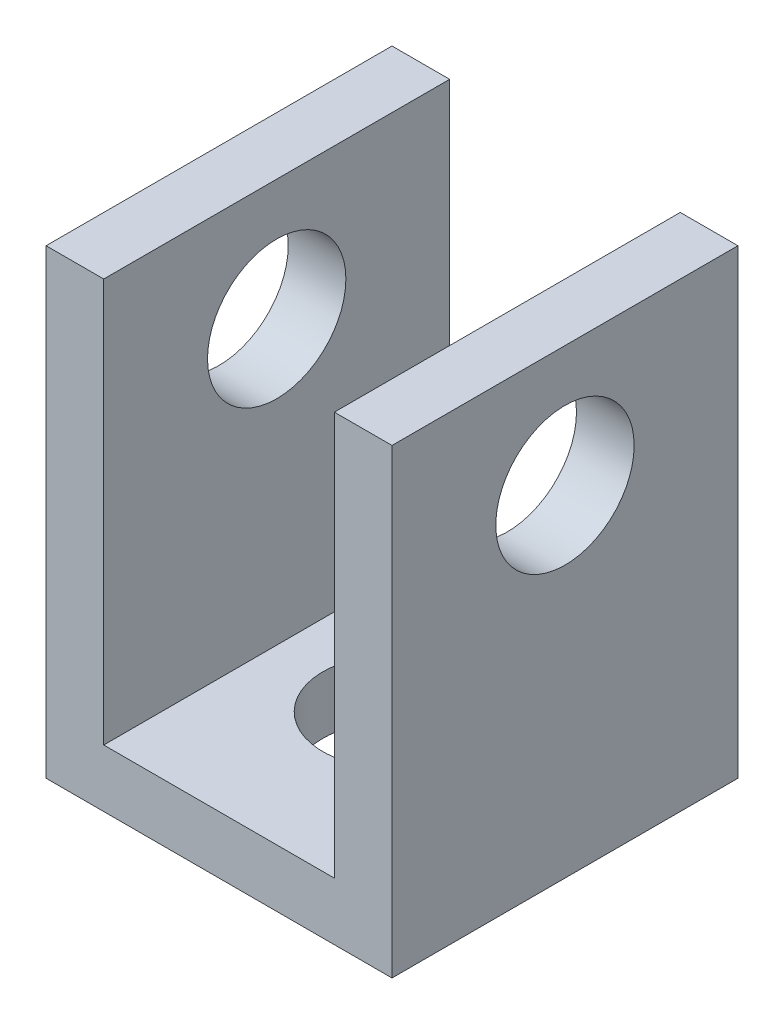
ISO-10303-21;
HEADER;
FILE_DESCRIPTION(('STEP AP214'),'2;1');
FILE_NAME('part.step','',(''),(''),'','','');
FILE_SCHEMA(('AUTOMOTIVE_DESIGN { 1 0 10303 214 1 1 1 1 }'));
ENDSEC;
DATA;
#1=APPLICATION_CONTEXT('core data for automotive mechanical design processes');
#2=APPLICATION_PROTOCOL_DEFINITION('international standard','automotive_design',2000,#1);
#3=PRODUCT_CONTEXT('',#1,'mechanical');
#4=PRODUCT('Part','Part','',(#3));
#5=PRODUCT_RELATED_PRODUCT_CATEGORY('part','',(#4));
#6=PRODUCT_DEFINITION_FORMATION('','',#4);
#7=PRODUCT_DEFINITION_CONTEXT('part definition',#1,'design');
#8=PRODUCT_DEFINITION('design','',#6,#7);
#9=PRODUCT_DEFINITION_SHAPE('','',#8);
#10=(LENGTH_UNIT() NAMED_UNIT(*) SI_UNIT(.MILLI.,.METRE.));
#11=(NAMED_UNIT(*) PLANE_ANGLE_UNIT() SI_UNIT($,.RADIAN.));
#12=(NAMED_UNIT(*) SI_UNIT($,.STERADIAN.) SOLID_ANGLE_UNIT());
#13=UNCERTAINTY_MEASURE_WITH_UNIT(LENGTH_MEASURE(1.E-05),#10,'distance_accuracy_value','');
#14=(GEOMETRIC_REPRESENTATION_CONTEXT(3) GLOBAL_UNCERTAINTY_ASSIGNED_CONTEXT((#13)) GLOBAL_UNIT_ASSIGNED_CONTEXT((#10,
#11,#12)) REPRESENTATION_CONTEXT('',''));
#15=CARTESIAN_POINT('',(0.,0.,0.));
#16=DIRECTION('',(0.,0.,1.));
#17=DIRECTION('',(1.,0.,0.));
#18=AXIS2_PLACEMENT_3D('',#15,#16,#17);
#19=CARTESIAN_POINT('',(-30.1753227270851,12.3518767281582,15.));
#20=DIRECTION('',(0.,-1.,0.));
#21=DIRECTION('',(0.,0.,-1.));
#22=AXIS2_PLACEMENT_3D('',#19,#20,#21);
#23=PLANE('',#22);
#24=DIRECTION('',(-1.,0.,0.));
#25=VECTOR('',#24,1.);
#26=CARTESIAN_POINT('',(-30.1753227270851,12.3518767281582,0.));
#27=LINE('',#26,#25);
#28=CARTESIAN_POINT('',(-27.6753227270851,12.3518767281582,0.));
#29=VERTEX_POINT('',#28);
#30=CARTESIAN_POINT('',(-30.1753227270851,12.3518767281582,0.));
#31=VERTEX_POINT('',#30);
#32=EDGE_CURVE('E130',#29,#31,#27,.T.);
#33=ORIENTED_EDGE('',*,*,#32,.T.);
#34=DIRECTION('',(0.,0.,-1.));
#35=VECTOR('',#34,1.);
#36=CARTESIAN_POINT('',(-30.1753227270851,12.3518767281582,15.));
#37=LINE('',#36,#35);
#38=CARTESIAN_POINT('',(-30.1753227270851,12.3518767281582,15.));
#39=VERTEX_POINT('',#38);
#40=EDGE_CURVE('E11',#39,#31,#37,.T.);
#41=ORIENTED_EDGE('',*,*,#40,.F.);
#42=DIRECTION('',(-1.,0.,0.));
#43=VECTOR('',#42,1.);
#44=CARTESIAN_POINT('',(-30.1753227270851,12.3518767281582,15.));
#45=LINE('',#44,#43);
#46=CARTESIAN_POINT('',(-27.6753227270851,12.3518767281582,15.));
#47=VERTEX_POINT('',#46);
#48=EDGE_CURVE('E145',#47,#39,#45,.T.);
#49=ORIENTED_EDGE('',*,*,#48,.F.);
#50=DIRECTION('',(0.,0.,-1.));
#51=VECTOR('',#50,1.);
#52=CARTESIAN_POINT('',(-27.6753227270851,12.3518767281582,15.));
#53=LINE('',#52,#51);
#54=EDGE_CURVE('E126',#47,#29,#53,.T.);
#55=ORIENTED_EDGE('',*,*,#54,.T.);
#56=EDGE_LOOP('',(#33,#41,#49,#55));
#57=FACE_BOUND('',#56,.T.);
#58=ADVANCED_FACE('F32',(#57),#23,.F.);
#59=CARTESIAN_POINT('',(-30.1753227270851,12.3518767281582,15.));
#60=DIRECTION('',(1.,0.,0.));
#61=DIRECTION('',(0.,0.,-1.));
#62=AXIS2_PLACEMENT_3D('',#59,#60,#61);
#63=PLANE('',#62);
#64=CARTESIAN_POINT('',(-30.1753227270851,7.1040536915522,7.5));
#65=DIRECTION('',(1.,0.,0.));
#66=DIRECTION('',(0.,0.,-1.));
#67=AXIS2_PLACEMENT_3D('',#64,#65,#66);
#68=CIRCLE('',#67,3.);
#69=CARTESIAN_POINT('',(-30.1753227270851,7.1040536915522,4.5));
#70=VERTEX_POINT('',#69);
#71=EDGE_CURVE('E134',#70,#70,#68,.T.);
#72=ORIENTED_EDGE('',*,*,#71,.T.);
#73=EDGE_LOOP('',(#72));
#74=FACE_BOUND('',#73,.T.);
#75=DIRECTION('',(0.,-1.,0.));
#76=VECTOR('',#75,1.);
#77=CARTESIAN_POINT('',(-30.1753227270851,12.3518767281582,0.));
#78=LINE('',#77,#76);
#79=CARTESIAN_POINT('',(-30.1753227270851,-7.64812327184185,0.));
#80=VERTEX_POINT('',#79);
#81=EDGE_CURVE('E133',#31,#80,#78,.T.);
#82=ORIENTED_EDGE('',*,*,#81,.T.);
#83=DIRECTION('',(0.,0.,-1.));
#84=VECTOR('',#83,1.);
#85=CARTESIAN_POINT('',(-30.1753227270851,-7.64812327184185,15.));
#86=LINE('',#85,#84);
#87=CARTESIAN_POINT('',(-30.1753227270851,-7.64812327184185,15.));
#88=VERTEX_POINT('',#87);
#89=EDGE_CURVE('E41',#88,#80,#86,.T.);
#90=ORIENTED_EDGE('',*,*,#89,.F.);
#91=DIRECTION('',(0.,-1.,0.));
#92=VECTOR('',#91,1.);
#93=CARTESIAN_POINT('',(-30.1753227270851,12.3518767281582,15.));
#94=LINE('',#93,#92);
#95=EDGE_CURVE('E93',#39,#88,#94,.T.);
#96=ORIENTED_EDGE('',*,*,#95,.F.);
#97=ORIENTED_EDGE('',*,*,#40,.T.);
#98=EDGE_LOOP('',(#82,#90,#96,#97));
#99=FACE_BOUND('',#98,.T.);
#100=ADVANCED_FACE('F208',(#74,#99),#63,.F.);
#101=CARTESIAN_POINT('',(-30.1753227270851,-7.64812327184185,15.));
#102=DIRECTION('',(0.,1.,0.));
#103=DIRECTION('',(0.,0.,1.));
#104=AXIS2_PLACEMENT_3D('',#101,#102,#103);
#105=PLANE('',#104);
#106=CARTESIAN_POINT('',(-22.6753227270851,-7.64812327184185,7.5));
#107=DIRECTION('',(0.,-1.,0.));
#108=DIRECTION('',(0.,0.,-1.));
#109=AXIS2_PLACEMENT_3D('',#106,#107,#108);
#110=CIRCLE('',#109,3.);
#111=CARTESIAN_POINT('',(-22.6753227270851,-7.64812327184185,4.5));
#112=VERTEX_POINT('',#111);
#113=EDGE_CURVE('E169',#112,#112,#110,.T.);
#114=ORIENTED_EDGE('',*,*,#113,.F.);
#115=EDGE_LOOP('',(#114));
#116=FACE_BOUND('',#115,.T.);
#117=DIRECTION('',(1.,0.,0.));
#118=VECTOR('',#117,1.);
#119=CARTESIAN_POINT('',(-30.1753227270851,-7.64812327184185,0.));
#120=LINE('',#119,#118);
#121=CARTESIAN_POINT('',(-15.1753227270851,-7.64812327184185,0.));
#122=VERTEX_POINT('',#121);
#123=EDGE_CURVE('E136',#80,#122,#120,.T.);
#124=ORIENTED_EDGE('',*,*,#123,.T.);
#125=DIRECTION('',(0.,0.,-1.));
#126=VECTOR('',#125,1.);
#127=CARTESIAN_POINT('',(-15.1753227270851,-7.64812327184185,15.));
#128=LINE('',#127,#126);
#129=CARTESIAN_POINT('',(-15.1753227270851,-7.64812327184185,15.));
#130=VERTEX_POINT('',#129);
#131=EDGE_CURVE('E152',#130,#122,#128,.T.);
#132=ORIENTED_EDGE('',*,*,#131,.F.);
#133=DIRECTION('',(1.,0.,0.));
#134=VECTOR('',#133,1.);
#135=CARTESIAN_POINT('',(-30.1753227270851,-7.64812327184185,15.));
#136=LINE('',#135,#134);
#137=EDGE_CURVE('E176',#88,#130,#136,.T.);
#138=ORIENTED_EDGE('',*,*,#137,.F.);
#139=ORIENTED_EDGE('',*,*,#89,.T.);
#140=EDGE_LOOP('',(#124,#132,#138,#139));
#141=FACE_BOUND('',#140,.T.);
#142=ADVANCED_FACE('F212',(#116,#141),#105,.F.);
#143=CARTESIAN_POINT('',(-15.1753227270851,-7.64812327184185,15.));
#144=DIRECTION('',(-1.,0.,0.));
#145=DIRECTION('',(0.,0.,1.));
#146=AXIS2_PLACEMENT_3D('',#143,#144,#145);
#147=PLANE('',#146);
#148=CARTESIAN_POINT('',(-15.1753227270851,7.1040536915522,7.5));
#149=DIRECTION('',(1.,0.,0.));
#150=DIRECTION('',(0.,0.,-1.));
#151=AXIS2_PLACEMENT_3D('',#148,#149,#150);
#152=CIRCLE('',#151,3.);
#153=CARTESIAN_POINT('',(-15.1753227270851,7.1040536915522,4.5));
#154=VERTEX_POINT('',#153);
#155=EDGE_CURVE('E159',#154,#154,#152,.T.);
#156=ORIENTED_EDGE('',*,*,#155,.F.);
#157=EDGE_LOOP('',(#156));
#158=FACE_BOUND('',#157,.T.);
#159=DIRECTION('',(0.,1.,0.));
#160=VECTOR('',#159,1.);
#161=CARTESIAN_POINT('',(-15.1753227270851,-7.64812327184185,0.));
#162=LINE('',#161,#160);
#163=CARTESIAN_POINT('',(-15.1753227270851,12.3518767281582,0.));
#164=VERTEX_POINT('',#163);
#165=EDGE_CURVE('E138',#122,#164,#162,.T.);
#166=ORIENTED_EDGE('',*,*,#165,.T.);
#167=DIRECTION('',(0.,0.,-1.));
#168=VECTOR('',#167,1.);
#169=CARTESIAN_POINT('',(-15.1753227270851,12.3518767281582,15.));
#170=LINE('',#169,#168);
#171=CARTESIAN_POINT('',(-15.1753227270851,12.3518767281582,15.));
#172=VERTEX_POINT('',#171);
#173=EDGE_CURVE('E149',#172,#164,#170,.T.);
#174=ORIENTED_EDGE('',*,*,#173,.F.);
#175=DIRECTION('',(0.,1.,0.));
#176=VECTOR('',#175,1.);
#177=CARTESIAN_POINT('',(-15.1753227270851,-7.64812327184185,15.));
#178=LINE('',#177,#176);
#179=EDGE_CURVE('E178',#130,#172,#178,.T.);
#180=ORIENTED_EDGE('',*,*,#179,.F.);
#181=ORIENTED_EDGE('',*,*,#131,.T.);
#182=EDGE_LOOP('',(#166,#174,#180,#181));
#183=FACE_BOUND('',#182,.T.);
#184=ADVANCED_FACE('F184',(#158,#183),#147,.F.);
#185=CARTESIAN_POINT('',(-17.6753227270851,12.3518767281582,15.));
#186=DIRECTION('',(0.,-1.,0.));
#187=DIRECTION('',(0.,0.,-1.));
#188=AXIS2_PLACEMENT_3D('',#185,#186,#187);
#189=PLANE('',#188);
#190=DIRECTION('',(-1.,0.,0.));
#191=VECTOR('',#190,1.);
#192=CARTESIAN_POINT('',(-17.6753227270851,12.3518767281582,0.));
#193=LINE('',#192,#191);
#194=CARTESIAN_POINT('',(-17.6753227270851,12.3518767281582,0.));
#195=VERTEX_POINT('',#194);
#196=EDGE_CURVE('E140',#164,#195,#193,.T.);
#197=ORIENTED_EDGE('',*,*,#196,.T.);
#198=DIRECTION('',(0.,0.,-1.));
#199=VECTOR('',#198,1.);
#200=CARTESIAN_POINT('',(-17.6753227270851,12.3518767281582,15.));
#201=LINE('',#200,#199);
#202=CARTESIAN_POINT('',(-17.6753227270851,12.3518767281582,15.));
#203=VERTEX_POINT('',#202);
#204=EDGE_CURVE('E121',#203,#195,#201,.T.);
#205=ORIENTED_EDGE('',*,*,#204,.F.);
#206=DIRECTION('',(-1.,0.,0.));
#207=VECTOR('',#206,1.);
#208=CARTESIAN_POINT('',(-17.6753227270851,12.3518767281582,15.));
#209=LINE('',#208,#207);
#210=EDGE_CURVE('E112',#172,#203,#209,.T.);
#211=ORIENTED_EDGE('',*,*,#210,.F.);
#212=ORIENTED_EDGE('',*,*,#173,.T.);
#213=EDGE_LOOP('',(#197,#205,#211,#212));
#214=FACE_BOUND('',#213,.T.);
#215=ADVANCED_FACE('F188',(#214),#189,.F.);
#216=CARTESIAN_POINT('',(-17.6753227270851,-5.14812327184185,15.));
#217=DIRECTION('',(1.,0.,0.));
#218=DIRECTION('',(0.,0.,-1.));
#219=AXIS2_PLACEMENT_3D('',#216,#217,#218);
#220=PLANE('',#219);
#221=CARTESIAN_POINT('',(-17.6753227270851,7.1040536915522,7.5));
#222=DIRECTION('',(1.,0.,0.));
#223=DIRECTION('',(0.,0.,-1.));
#224=AXIS2_PLACEMENT_3D('',#221,#222,#223);
#225=CIRCLE('',#224,3.);
#226=CARTESIAN_POINT('',(-17.6753227270851,7.1040536915522,4.5));
#227=VERTEX_POINT('',#226);
#228=EDGE_CURVE('E158',#227,#227,#225,.T.);
#229=ORIENTED_EDGE('',*,*,#228,.T.);
#230=EDGE_LOOP('',(#229));
#231=FACE_BOUND('',#230,.T.);
#232=DIRECTION('',(0.,-1.,0.));
#233=VECTOR('',#232,1.);
#234=CARTESIAN_POINT('',(-17.6753227270851,-5.14812327184185,0.));
#235=LINE('',#234,#233);
#236=CARTESIAN_POINT('',(-17.6753227270851,-5.14812327184185,0.));
#237=VERTEX_POINT('',#236);
#238=EDGE_CURVE('E120',#195,#237,#235,.T.);
#239=ORIENTED_EDGE('',*,*,#238,.T.);
#240=DIRECTION('',(0.,0.,-1.));
#241=VECTOR('',#240,1.);
#242=CARTESIAN_POINT('',(-17.6753227270851,-5.14812327184185,15.));
#243=LINE('',#242,#241);
#244=CARTESIAN_POINT('',(-17.6753227270851,-5.14812327184185,15.));
#245=VERTEX_POINT('',#244);
#246=EDGE_CURVE('E117',#245,#237,#243,.T.);
#247=ORIENTED_EDGE('',*,*,#246,.F.);
#248=DIRECTION('',(0.,-1.,0.));
#249=VECTOR('',#248,1.);
#250=CARTESIAN_POINT('',(-17.6753227270851,-5.14812327184185,15.));
#251=LINE('',#250,#249);
#252=EDGE_CURVE('E106',#203,#245,#251,.T.);
#253=ORIENTED_EDGE('',*,*,#252,.F.);
#254=ORIENTED_EDGE('',*,*,#204,.T.);
#255=EDGE_LOOP('',(#239,#247,#253,#254));
#256=FACE_BOUND('',#255,.T.);
#257=ADVANCED_FACE('F118',(#231,#256),#220,.F.);
#258=CARTESIAN_POINT('',(-27.6753227270851,-5.14812327184185,15.));
#259=DIRECTION('',(0.,-1.,0.));
#260=DIRECTION('',(0.,0.,-1.));
#261=AXIS2_PLACEMENT_3D('',#258,#259,#260);
#262=PLANE('',#261);
#263=CARTESIAN_POINT('',(-22.6753227270851,-5.14812327184185,7.5));
#264=DIRECTION('',(0.,-1.,0.));
#265=DIRECTION('',(0.,0.,-1.));
#266=AXIS2_PLACEMENT_3D('',#263,#264,#265);
#267=CIRCLE('',#266,3.);
#268=CARTESIAN_POINT('',(-22.6753227270851,-5.14812327184185,4.5));
#269=VERTEX_POINT('',#268);
#270=EDGE_CURVE('E35',#269,#269,#267,.T.);
#271=ORIENTED_EDGE('',*,*,#270,.T.);
#272=EDGE_LOOP('',(#271));
#273=FACE_BOUND('',#272,.T.);
#274=DIRECTION('',(-1.,0.,0.));
#275=VECTOR('',#274,1.);
#276=CARTESIAN_POINT('',(-27.6753227270851,-5.14812327184185,0.));
#277=LINE('',#276,#275);
#278=CARTESIAN_POINT('',(-27.6753227270851,-5.14812327184185,0.));
#279=VERTEX_POINT('',#278);
#280=EDGE_CURVE('E79',#237,#279,#277,.T.);
#281=ORIENTED_EDGE('',*,*,#280,.T.);
#282=DIRECTION('',(0.,0.,-1.));
#283=VECTOR('',#282,1.);
#284=CARTESIAN_POINT('',(-27.6753227270851,-5.14812327184185,15.));
#285=LINE('',#284,#283);
#286=CARTESIAN_POINT('',(-27.6753227270851,-5.14812327184185,15.));
#287=VERTEX_POINT('',#286);
#288=EDGE_CURVE('E122',#287,#279,#285,.T.);
#289=ORIENTED_EDGE('',*,*,#288,.F.);
#290=DIRECTION('',(-1.,0.,0.));
#291=VECTOR('',#290,1.);
#292=CARTESIAN_POINT('',(-27.6753227270851,-5.14812327184185,15.));
#293=LINE('',#292,#291);
#294=EDGE_CURVE('E110',#245,#287,#293,.T.);
#295=ORIENTED_EDGE('',*,*,#294,.F.);
#296=ORIENTED_EDGE('',*,*,#246,.T.);
#297=EDGE_LOOP('',(#281,#289,#295,#296));
#298=FACE_BOUND('',#297,.T.);
#299=ADVANCED_FACE('F124',(#273,#298),#262,.F.);
#300=CARTESIAN_POINT('',(-27.6753227270851,12.3518767281582,15.));
#301=DIRECTION('',(-1.,0.,0.));
#302=DIRECTION('',(0.,0.,1.));
#303=AXIS2_PLACEMENT_3D('',#300,#301,#302);
#304=PLANE('',#303);
#305=CARTESIAN_POINT('',(-27.6753227270851,7.1040536915522,7.5));
#306=DIRECTION('',(-1.,0.,0.));
#307=DIRECTION('',(0.,0.,1.));
#308=AXIS2_PLACEMENT_3D('',#305,#306,#307);
#309=CIRCLE('',#308,3.);
#310=CARTESIAN_POINT('',(-27.6753227270851,7.1040536915522,10.5));
#311=VERTEX_POINT('',#310);
#312=EDGE_CURVE('E156',#311,#311,#309,.T.);
#313=ORIENTED_EDGE('',*,*,#312,.T.);
#314=EDGE_LOOP('',(#313));
#315=FACE_BOUND('',#314,.T.);
#316=DIRECTION('',(0.,1.,0.));
#317=VECTOR('',#316,1.);
#318=CARTESIAN_POINT('',(-27.6753227270851,12.3518767281582,0.));
#319=LINE('',#318,#317);
#320=EDGE_CURVE('E85',#279,#29,#319,.T.);
#321=ORIENTED_EDGE('',*,*,#320,.T.);
#322=ORIENTED_EDGE('',*,*,#54,.F.);
#323=DIRECTION('',(0.,1.,0.));
#324=VECTOR('',#323,1.);
#325=CARTESIAN_POINT('',(-27.6753227270851,12.3518767281582,15.));
#326=LINE('',#325,#324);
#327=EDGE_CURVE('E50',#287,#47,#326,.T.);
#328=ORIENTED_EDGE('',*,*,#327,.F.);
#329=ORIENTED_EDGE('',*,*,#288,.T.);
#330=EDGE_LOOP('',(#321,#322,#328,#329));
#331=FACE_BOUND('',#330,.T.);
#332=ADVANCED_FACE('F196',(#315,#331),#304,.F.);
#333=CARTESIAN_POINT('',(0.,0.,15.));
#334=DIRECTION('',(0.,0.,-1.));
#335=DIRECTION('',(-1.,0.,0.));
#336=AXIS2_PLACEMENT_3D('',#333,#334,#335);
#337=PLANE('',#336);
#338=ORIENTED_EDGE('',*,*,#48,.T.);
#339=ORIENTED_EDGE('',*,*,#95,.T.);
#340=ORIENTED_EDGE('',*,*,#137,.T.);
#341=ORIENTED_EDGE('',*,*,#179,.T.);
#342=ORIENTED_EDGE('',*,*,#210,.T.);
#343=ORIENTED_EDGE('',*,*,#252,.T.);
#344=ORIENTED_EDGE('',*,*,#294,.T.);
#345=ORIENTED_EDGE('',*,*,#327,.T.);
#346=EDGE_LOOP('',(#338,#339,#340,#341,#342,#343,#344,#345));
#347=FACE_BOUND('',#346,.T.);
#348=ADVANCED_FACE('F108',(#347),#337,.F.);
#349=CARTESIAN_POINT('',(0.,0.,0.));
#350=DIRECTION('',(0.,0.,-1.));
#351=DIRECTION('',(-1.,0.,0.));
#352=AXIS2_PLACEMENT_3D('',#349,#350,#351);
#353=PLANE('',#352);
#354=ORIENTED_EDGE('',*,*,#32,.F.);
#355=ORIENTED_EDGE('',*,*,#320,.F.);
#356=ORIENTED_EDGE('',*,*,#280,.F.);
#357=ORIENTED_EDGE('',*,*,#238,.F.);
#358=ORIENTED_EDGE('',*,*,#196,.F.);
#359=ORIENTED_EDGE('',*,*,#165,.F.);
#360=ORIENTED_EDGE('',*,*,#123,.F.);
#361=ORIENTED_EDGE('',*,*,#81,.F.);
#362=EDGE_LOOP('',(#354,#355,#356,#357,#358,#359,#360,#361));
#363=FACE_BOUND('',#362,.T.);
#364=ADVANCED_FACE('F191',(#363),#353,.T.);
#365=CARTESIAN_POINT('',(-32.1753227270851,7.1040536915522,7.5));
#366=DIRECTION('',(1.,0.,0.));
#367=DIRECTION('',(0.,0.,-1.));
#368=AXIS2_PLACEMENT_3D('',#365,#366,#367);
#369=CYLINDRICAL_SURFACE('',#368,3.);
#370=ORIENTED_EDGE('',*,*,#312,.F.);
#371=EDGE_LOOP('',(#370));
#372=FACE_BOUND('',#371,.T.);
#373=ORIENTED_EDGE('',*,*,#71,.F.);
#374=EDGE_LOOP('',(#373));
#375=FACE_BOUND('',#374,.T.);
#376=ADVANCED_FACE('F234',(#372,#375),#369,.F.);
#377=ORIENTED_EDGE('',*,*,#155,.T.);
#378=EDGE_LOOP('',(#377));
#379=FACE_BOUND('',#378,.T.);
#380=ORIENTED_EDGE('',*,*,#228,.F.);
#381=EDGE_LOOP('',(#380));
#382=FACE_BOUND('',#381,.T.);
#383=ADVANCED_FACE('F231',(#379,#382),#369,.F.);
#384=CARTESIAN_POINT('',(-22.6753227270851,9.35187672815815,7.5));
#385=DIRECTION('',(0.,-1.,0.));
#386=DIRECTION('',(0.,0.,-1.));
#387=AXIS2_PLACEMENT_3D('',#384,#385,#386);
#388=CYLINDRICAL_SURFACE('',#387,3.);
#389=ORIENTED_EDGE('',*,*,#113,.T.);
#390=EDGE_LOOP('',(#389));
#391=FACE_BOUND('',#390,.T.);
#392=ORIENTED_EDGE('',*,*,#270,.F.);
#393=EDGE_LOOP('',(#392));
#394=FACE_BOUND('',#393,.T.);
#395=ADVANCED_FACE('F233',(#391,#394),#388,.F.);
#396=CLOSED_SHELL('',(#58,#100,#142,#184,#215,#257,#299,#332,#348,#364,#376,#383,#395));
#397=MANIFOLD_SOLID_BREP('B2',#396);
#398=ADVANCED_BREP_SHAPE_REPRESENTATION('',(#18,#397),#14);
#399=SHAPE_DEFINITION_REPRESENTATION(#9,#398);
ENDSEC;
END-ISO-10303-21;
